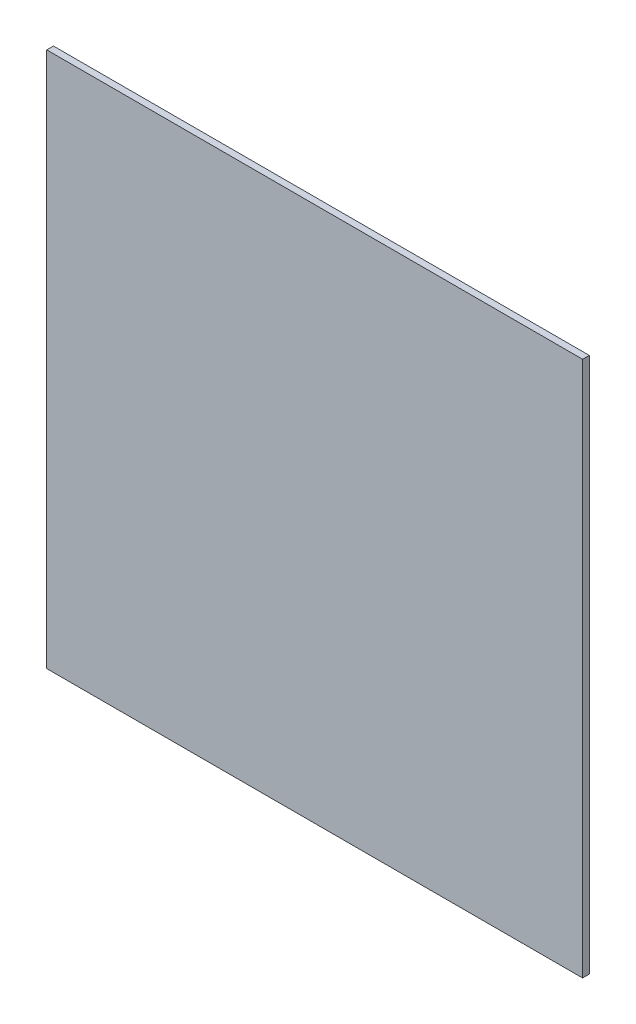
ISO-10303-21;
HEADER;
FILE_DESCRIPTION(('STEP AP214'),'2;1');
FILE_NAME('part.step','',(''),(''),'','','');
FILE_SCHEMA(('AUTOMOTIVE_DESIGN { 1 0 10303 214 1 1 1 1 }'));
ENDSEC;
DATA;
#1=APPLICATION_CONTEXT('core data for automotive mechanical design processes');
#2=APPLICATION_PROTOCOL_DEFINITION('international standard','automotive_design',2000,#1);
#3=PRODUCT_CONTEXT('',#1,'mechanical');
#4=PRODUCT('Part','Part','',(#3));
#5=PRODUCT_RELATED_PRODUCT_CATEGORY('part','',(#4));
#6=PRODUCT_DEFINITION_FORMATION('','',#4);
#7=PRODUCT_DEFINITION_CONTEXT('part definition',#1,'design');
#8=PRODUCT_DEFINITION('design','',#6,#7);
#9=PRODUCT_DEFINITION_SHAPE('','',#8);
#10=(LENGTH_UNIT() NAMED_UNIT(*) SI_UNIT(.MILLI.,.METRE.));
#11=(NAMED_UNIT(*) PLANE_ANGLE_UNIT() SI_UNIT($,.RADIAN.));
#12=(NAMED_UNIT(*) SI_UNIT($,.STERADIAN.) SOLID_ANGLE_UNIT());
#13=UNCERTAINTY_MEASURE_WITH_UNIT(LENGTH_MEASURE(1.E-05),#10,'distance_accuracy_value','');
#14=(GEOMETRIC_REPRESENTATION_CONTEXT(3) GLOBAL_UNCERTAINTY_ASSIGNED_CONTEXT((#13)) GLOBAL_UNIT_ASSIGNED_CONTEXT((#10,
#11,#12)) REPRESENTATION_CONTEXT('',''));
#15=CARTESIAN_POINT('',(0.,0.,0.));
#16=DIRECTION('',(0.,0.,1.));
#17=DIRECTION('',(1.,0.,0.));
#18=AXIS2_PLACEMENT_3D('',#15,#16,#17);
#19=CARTESIAN_POINT('',(70.6232812632283,0.,1.5875));
#20=DIRECTION('',(1.,0.,0.));
#21=DIRECTION('',(0.,1.,0.));
#22=AXIS2_PLACEMENT_3D('',#19,#20,#21);
#23=PLANE('',#22);
#24=DIRECTION('',(0.,-1.,0.));
#25=VECTOR('',#24,1.);
#26=CARTESIAN_POINT('',(70.6232812632283,0.,0.));
#27=LINE('',#26,#25);
#28=CARTESIAN_POINT('',(70.6232812632283,34.6733934432523,0.));
#29=VERTEX_POINT('',#28);
#30=CARTESIAN_POINT('',(70.6232812632284,-92.3266065567477,0.));
#31=VERTEX_POINT('',#30);
#32=EDGE_CURVE('E97',#29,#31,#27,.T.);
#33=ORIENTED_EDGE('',*,*,#32,.F.);
#34=DIRECTION('',(0.,0.,-1.));
#35=VECTOR('',#34,1.);
#36=CARTESIAN_POINT('',(70.6232812632283,34.6733934432523,1.5875));
#37=LINE('',#36,#35);
#38=CARTESIAN_POINT('',(70.6232812632283,34.6733934432523,1.5875));
#39=VERTEX_POINT('',#38);
#40=EDGE_CURVE('E11',#39,#29,#37,.T.);
#41=ORIENTED_EDGE('',*,*,#40,.F.);
#42=DIRECTION('',(0.,-1.,0.));
#43=VECTOR('',#42,1.);
#44=CARTESIAN_POINT('',(70.6232812632283,0.,1.5875));
#45=LINE('',#44,#43);
#46=CARTESIAN_POINT('',(70.6232812632284,-92.3266065567477,1.5875));
#47=VERTEX_POINT('',#46);
#48=EDGE_CURVE('E91',#39,#47,#45,.T.);
#49=ORIENTED_EDGE('',*,*,#48,.T.);
#50=DIRECTION('',(0.,0.,-1.));
#51=VECTOR('',#50,1.);
#52=CARTESIAN_POINT('',(70.6232812632284,-92.3266065567477,1.5875));
#53=LINE('',#52,#51);
#54=EDGE_CURVE('E72',#47,#31,#53,.T.);
#55=ORIENTED_EDGE('',*,*,#54,.T.);
#56=EDGE_LOOP('',(#33,#41,#49,#55));
#57=FACE_BOUND('',#56,.T.);
#58=ADVANCED_FACE('F34',(#57),#23,.T.);
#59=CARTESIAN_POINT('',(0.,34.6733934432523,1.5875));
#60=DIRECTION('',(0.,1.,0.));
#61=DIRECTION('',(0.,0.,1.));
#62=AXIS2_PLACEMENT_3D('',#59,#60,#61);
#63=PLANE('',#62);
#64=DIRECTION('',(1.,0.,0.));
#65=VECTOR('',#64,1.);
#66=CARTESIAN_POINT('',(0.,34.6733934432523,0.));
#67=LINE('',#66,#65);
#68=CARTESIAN_POINT('',(-56.3767187367717,34.6733934432523,0.));
#69=VERTEX_POINT('',#68);
#70=EDGE_CURVE('E85',#69,#29,#67,.T.);
#71=ORIENTED_EDGE('',*,*,#70,.F.);
#72=DIRECTION('',(0.,0.,-1.));
#73=VECTOR('',#72,1.);
#74=CARTESIAN_POINT('',(-56.3767187367717,34.6733934432523,1.5875));
#75=LINE('',#74,#73);
#76=CARTESIAN_POINT('',(-56.3767187367717,34.6733934432523,1.5875));
#77=VERTEX_POINT('',#76);
#78=EDGE_CURVE('E42',#77,#69,#75,.T.);
#79=ORIENTED_EDGE('',*,*,#78,.F.);
#80=DIRECTION('',(1.,0.,0.));
#81=VECTOR('',#80,1.);
#82=CARTESIAN_POINT('',(0.,34.6733934432523,1.5875));
#83=LINE('',#82,#81);
#84=EDGE_CURVE('E83',#77,#39,#83,.T.);
#85=ORIENTED_EDGE('',*,*,#84,.T.);
#86=ORIENTED_EDGE('',*,*,#40,.T.);
#87=EDGE_LOOP('',(#71,#79,#85,#86));
#88=FACE_BOUND('',#87,.T.);
#89=ADVANCED_FACE('F81',(#88),#63,.T.);
#90=CARTESIAN_POINT('',(-56.3767187367717,0.,1.5875));
#91=DIRECTION('',(1.,0.,0.));
#92=DIRECTION('',(0.,1.,0.));
#93=AXIS2_PLACEMENT_3D('',#90,#91,#92);
#94=PLANE('',#93);
#95=DIRECTION('',(0.,-1.,0.));
#96=VECTOR('',#95,1.);
#97=CARTESIAN_POINT('',(-56.3767187367717,0.,0.));
#98=LINE('',#97,#96);
#99=CARTESIAN_POINT('',(-56.3767187367716,-92.3266065567477,0.));
#100=VERTEX_POINT('',#99);
#101=EDGE_CURVE('E65',#69,#100,#98,.T.);
#102=ORIENTED_EDGE('',*,*,#101,.T.);
#103=DIRECTION('',(0.,0.,-1.));
#104=VECTOR('',#103,1.);
#105=CARTESIAN_POINT('',(-56.3767187367716,-92.3266065567477,1.5875));
#106=LINE('',#105,#104);
#107=CARTESIAN_POINT('',(-56.3767187367716,-92.3266065567477,1.5875));
#108=VERTEX_POINT('',#107);
#109=EDGE_CURVE('E86',#108,#100,#106,.T.);
#110=ORIENTED_EDGE('',*,*,#109,.F.);
#111=DIRECTION('',(0.,-1.,0.));
#112=VECTOR('',#111,1.);
#113=CARTESIAN_POINT('',(-56.3767187367717,0.,1.5875));
#114=LINE('',#113,#112);
#115=EDGE_CURVE('E87',#77,#108,#114,.T.);
#116=ORIENTED_EDGE('',*,*,#115,.F.);
#117=ORIENTED_EDGE('',*,*,#78,.T.);
#118=EDGE_LOOP('',(#102,#110,#116,#117));
#119=FACE_BOUND('',#118,.T.);
#120=ADVANCED_FACE('F88',(#119),#94,.F.);
#121=CARTESIAN_POINT('',(0.,-92.3266065567477,1.5875));
#122=DIRECTION('',(0.,1.,0.));
#123=DIRECTION('',(0.,0.,1.));
#124=AXIS2_PLACEMENT_3D('',#121,#122,#123);
#125=PLANE('',#124);
#126=DIRECTION('',(1.,0.,0.));
#127=VECTOR('',#126,1.);
#128=CARTESIAN_POINT('',(0.,-92.3266065567477,0.));
#129=LINE('',#128,#127);
#130=EDGE_CURVE('E93',#100,#31,#129,.T.);
#131=ORIENTED_EDGE('',*,*,#130,.T.);
#132=ORIENTED_EDGE('',*,*,#54,.F.);
#133=DIRECTION('',(1.,0.,0.));
#134=VECTOR('',#133,1.);
#135=CARTESIAN_POINT('',(0.,-92.3266065567477,1.5875));
#136=LINE('',#135,#134);
#137=EDGE_CURVE('E50',#108,#47,#136,.T.);
#138=ORIENTED_EDGE('',*,*,#137,.F.);
#139=ORIENTED_EDGE('',*,*,#109,.T.);
#140=EDGE_LOOP('',(#131,#132,#138,#139));
#141=FACE_BOUND('',#140,.T.);
#142=ADVANCED_FACE('F106',(#141),#125,.F.);
#143=CARTESIAN_POINT('',(0.,0.,1.5875));
#144=DIRECTION('',(0.,0.,1.));
#145=DIRECTION('',(1.,0.,0.));
#146=AXIS2_PLACEMENT_3D('',#143,#144,#145);
#147=PLANE('',#146);
#148=ORIENTED_EDGE('',*,*,#48,.F.);
#149=ORIENTED_EDGE('',*,*,#84,.F.);
#150=ORIENTED_EDGE('',*,*,#115,.T.);
#151=ORIENTED_EDGE('',*,*,#137,.T.);
#152=EDGE_LOOP('',(#148,#149,#150,#151));
#153=FACE_BOUND('',#152,.T.);
#154=ADVANCED_FACE('F90',(#153),#147,.T.);
#155=CARTESIAN_POINT('',(0.,0.,0.));
#156=DIRECTION('',(0.,0.,1.));
#157=DIRECTION('',(1.,0.,0.));
#158=AXIS2_PLACEMENT_3D('',#155,#156,#157);
#159=PLANE('',#158);
#160=ORIENTED_EDGE('',*,*,#32,.T.);
#161=ORIENTED_EDGE('',*,*,#130,.F.);
#162=ORIENTED_EDGE('',*,*,#101,.F.);
#163=ORIENTED_EDGE('',*,*,#70,.T.);
#164=EDGE_LOOP('',(#160,#161,#162,#163));
#165=FACE_BOUND('',#164,.T.);
#166=ADVANCED_FACE('F108',(#165),#159,.F.);
#167=CLOSED_SHELL('',(#58,#89,#120,#142,#154,#166));
#168=MANIFOLD_SOLID_BREP('B2',#167);
#169=ADVANCED_BREP_SHAPE_REPRESENTATION('',(#18,#168),#14);
#170=SHAPE_DEFINITION_REPRESENTATION(#9,#169);
ENDSEC;
END-ISO-10303-21;
